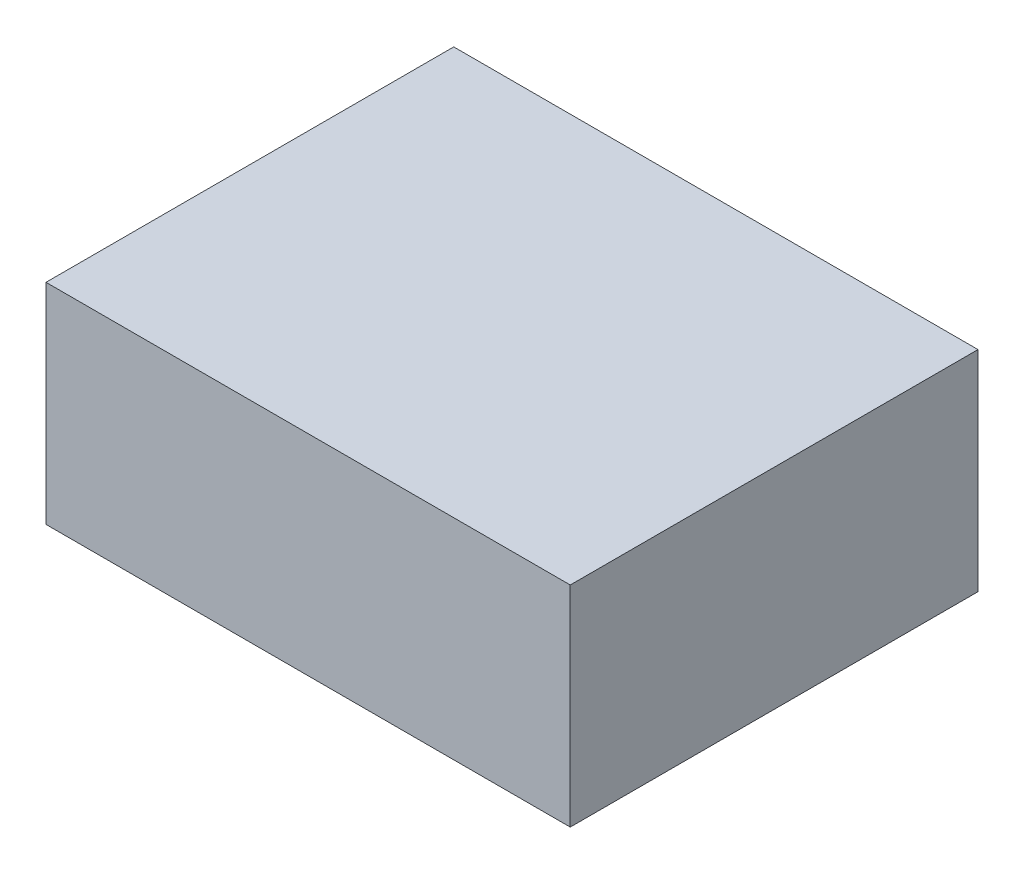
ISO-10303-21;
HEADER;
FILE_DESCRIPTION(('STEP AP214'),'2;1');
FILE_NAME('part.step','',(''),(''),'','','');
FILE_SCHEMA(('AUTOMOTIVE_DESIGN { 1 0 10303 214 1 1 1 1 }'));
ENDSEC;
DATA;
#1=APPLICATION_CONTEXT('core data for automotive mechanical design processes');
#2=APPLICATION_PROTOCOL_DEFINITION('international standard','automotive_design',2000,#1);
#3=PRODUCT_CONTEXT('',#1,'mechanical');
#4=PRODUCT('Part','Part','',(#3));
#5=PRODUCT_RELATED_PRODUCT_CATEGORY('part','',(#4));
#6=PRODUCT_DEFINITION_FORMATION('','',#4);
#7=PRODUCT_DEFINITION_CONTEXT('part definition',#1,'design');
#8=PRODUCT_DEFINITION('design','',#6,#7);
#9=PRODUCT_DEFINITION_SHAPE('','',#8);
#10=(LENGTH_UNIT() NAMED_UNIT(*) SI_UNIT(.MILLI.,.METRE.));
#11=(NAMED_UNIT(*) PLANE_ANGLE_UNIT() SI_UNIT($,.RADIAN.));
#12=(NAMED_UNIT(*) SI_UNIT($,.STERADIAN.) SOLID_ANGLE_UNIT());
#13=UNCERTAINTY_MEASURE_WITH_UNIT(LENGTH_MEASURE(1.E-05),#10,'distance_accuracy_value','');
#14=(GEOMETRIC_REPRESENTATION_CONTEXT(3) GLOBAL_UNCERTAINTY_ASSIGNED_CONTEXT((#13)) GLOBAL_UNIT_ASSIGNED_CONTEXT((#10,
#11,#12)) REPRESENTATION_CONTEXT('',''));
#15=CARTESIAN_POINT('',(0.,0.,0.));
#16=DIRECTION('',(0.,0.,1.));
#17=DIRECTION('',(1.,0.,0.));
#18=AXIS2_PLACEMENT_3D('',#15,#16,#17);
#19=CARTESIAN_POINT('',(22.5,18.,17.5));
#20=DIRECTION('',(-1.,0.,0.));
#21=DIRECTION('',(0.,0.,1.));
#22=AXIS2_PLACEMENT_3D('',#19,#20,#21);
#23=PLANE('',#22);
#24=DIRECTION('',(0.,0.,-1.));
#25=VECTOR('',#24,1.);
#26=CARTESIAN_POINT('',(22.5,0.,17.5));
#27=LINE('',#26,#25);
#28=CARTESIAN_POINT('',(22.5,0.,17.5));
#29=VERTEX_POINT('',#28);
#30=CARTESIAN_POINT('',(22.5,0.,-17.5));
#31=VERTEX_POINT('',#30);
#32=EDGE_CURVE('E105',#29,#31,#27,.T.);
#33=ORIENTED_EDGE('',*,*,#32,.T.);
#34=DIRECTION('',(0.,-1.,0.));
#35=VECTOR('',#34,1.);
#36=CARTESIAN_POINT('',(22.5,18.,-17.5));
#37=LINE('',#36,#35);
#38=CARTESIAN_POINT('',(22.5,18.,-17.5));
#39=VERTEX_POINT('',#38);
#40=EDGE_CURVE('E11',#39,#31,#37,.T.);
#41=ORIENTED_EDGE('',*,*,#40,.F.);
#42=DIRECTION('',(0.,0.,-1.));
#43=VECTOR('',#42,1.);
#44=CARTESIAN_POINT('',(22.5,18.,17.5));
#45=LINE('',#44,#43);
#46=CARTESIAN_POINT('',(22.5,18.,17.5));
#47=VERTEX_POINT('',#46);
#48=EDGE_CURVE('E88',#47,#39,#45,.T.);
#49=ORIENTED_EDGE('',*,*,#48,.F.);
#50=DIRECTION('',(0.,-1.,0.));
#51=VECTOR('',#50,1.);
#52=CARTESIAN_POINT('',(22.5,18.,17.5));
#53=LINE('',#52,#51);
#54=EDGE_CURVE('E101',#47,#29,#53,.T.);
#55=ORIENTED_EDGE('',*,*,#54,.T.);
#56=EDGE_LOOP('',(#33,#41,#49,#55));
#57=FACE_BOUND('',#56,.T.);
#58=ADVANCED_FACE('F36',(#57),#23,.F.);
#59=CARTESIAN_POINT('',(-22.5,18.,-17.5));
#60=DIRECTION('',(0.,0.,1.));
#61=DIRECTION('',(1.,0.,0.));
#62=AXIS2_PLACEMENT_3D('',#59,#60,#61);
#63=PLANE('',#62);
#64=DIRECTION('',(-1.,0.,0.));
#65=VECTOR('',#64,1.);
#66=CARTESIAN_POINT('',(-22.5,0.,-17.5));
#67=LINE('',#66,#65);
#68=CARTESIAN_POINT('',(-22.5,0.,-17.5));
#69=VERTEX_POINT('',#68);
#70=EDGE_CURVE('E93',#31,#69,#67,.T.);
#71=ORIENTED_EDGE('',*,*,#70,.T.);
#72=DIRECTION('',(0.,-1.,0.));
#73=VECTOR('',#72,1.);
#74=CARTESIAN_POINT('',(-22.5,18.,-17.5));
#75=LINE('',#74,#73);
#76=CARTESIAN_POINT('',(-22.5,18.,-17.5));
#77=VERTEX_POINT('',#76);
#78=EDGE_CURVE('E45',#77,#69,#75,.T.);
#79=ORIENTED_EDGE('',*,*,#78,.F.);
#80=DIRECTION('',(-1.,0.,0.));
#81=VECTOR('',#80,1.);
#82=CARTESIAN_POINT('',(-22.5,18.,-17.5));
#83=LINE('',#82,#81);
#84=EDGE_CURVE('E83',#39,#77,#83,.T.);
#85=ORIENTED_EDGE('',*,*,#84,.F.);
#86=ORIENTED_EDGE('',*,*,#40,.T.);
#87=EDGE_LOOP('',(#71,#79,#85,#86));
#88=FACE_BOUND('',#87,.T.);
#89=ADVANCED_FACE('F92',(#88),#63,.F.);
#90=CARTESIAN_POINT('',(-22.5,18.,17.5));
#91=DIRECTION('',(1.,0.,0.));
#92=DIRECTION('',(0.,0.,-1.));
#93=AXIS2_PLACEMENT_3D('',#90,#91,#92);
#94=PLANE('',#93);
#95=DIRECTION('',(0.,0.,1.));
#96=VECTOR('',#95,1.);
#97=CARTESIAN_POINT('',(-22.5,0.,17.5));
#98=LINE('',#97,#96);
#99=CARTESIAN_POINT('',(-22.5,0.,17.5));
#100=VERTEX_POINT('',#99);
#101=EDGE_CURVE('E70',#69,#100,#98,.T.);
#102=ORIENTED_EDGE('',*,*,#101,.T.);
#103=DIRECTION('',(0.,-1.,0.));
#104=VECTOR('',#103,1.);
#105=CARTESIAN_POINT('',(-22.5,18.,17.5));
#106=LINE('',#105,#104);
#107=CARTESIAN_POINT('',(-22.5,18.,17.5));
#108=VERTEX_POINT('',#107);
#109=EDGE_CURVE('E95',#108,#100,#106,.T.);
#110=ORIENTED_EDGE('',*,*,#109,.F.);
#111=DIRECTION('',(0.,0.,1.));
#112=VECTOR('',#111,1.);
#113=CARTESIAN_POINT('',(-22.5,18.,17.5));
#114=LINE('',#113,#112);
#115=EDGE_CURVE('E86',#77,#108,#114,.T.);
#116=ORIENTED_EDGE('',*,*,#115,.F.);
#117=ORIENTED_EDGE('',*,*,#78,.T.);
#118=EDGE_LOOP('',(#102,#110,#116,#117));
#119=FACE_BOUND('',#118,.T.);
#120=ADVANCED_FACE('F96',(#119),#94,.F.);
#121=CARTESIAN_POINT('',(-22.5,18.,17.5));
#122=DIRECTION('',(0.,0.,-1.));
#123=DIRECTION('',(-1.,0.,0.));
#124=AXIS2_PLACEMENT_3D('',#121,#122,#123);
#125=PLANE('',#124);
#126=DIRECTION('',(1.,0.,0.));
#127=VECTOR('',#126,1.);
#128=CARTESIAN_POINT('',(-22.5,0.,17.5));
#129=LINE('',#128,#127);
#130=EDGE_CURVE('E76',#100,#29,#129,.T.);
#131=ORIENTED_EDGE('',*,*,#130,.T.);
#132=ORIENTED_EDGE('',*,*,#54,.F.);
#133=DIRECTION('',(1.,0.,0.));
#134=VECTOR('',#133,1.);
#135=CARTESIAN_POINT('',(-22.5,18.,17.5));
#136=LINE('',#135,#134);
#137=EDGE_CURVE('E53',#108,#47,#136,.T.);
#138=ORIENTED_EDGE('',*,*,#137,.F.);
#139=ORIENTED_EDGE('',*,*,#109,.T.);
#140=EDGE_LOOP('',(#131,#132,#138,#139));
#141=FACE_BOUND('',#140,.T.);
#142=ADVANCED_FACE('F117',(#141),#125,.F.);
#143=CARTESIAN_POINT('',(0.,18.,0.));
#144=DIRECTION('',(0.,-1.,0.));
#145=DIRECTION('',(0.,0.,-1.));
#146=AXIS2_PLACEMENT_3D('',#143,#144,#145);
#147=PLANE('',#146);
#148=ORIENTED_EDGE('',*,*,#48,.T.);
#149=ORIENTED_EDGE('',*,*,#84,.T.);
#150=ORIENTED_EDGE('',*,*,#115,.T.);
#151=ORIENTED_EDGE('',*,*,#137,.T.);
#152=EDGE_LOOP('',(#148,#149,#150,#151));
#153=FACE_BOUND('',#152,.T.);
#154=ADVANCED_FACE('F84',(#153),#147,.F.);
#155=CARTESIAN_POINT('',(0.,0.,0.));
#156=DIRECTION('',(0.,-1.,0.));
#157=DIRECTION('',(0.,0.,-1.));
#158=AXIS2_PLACEMENT_3D('',#155,#156,#157);
#159=PLANE('',#158);
#160=ORIENTED_EDGE('',*,*,#32,.F.);
#161=ORIENTED_EDGE('',*,*,#130,.F.);
#162=ORIENTED_EDGE('',*,*,#101,.F.);
#163=ORIENTED_EDGE('',*,*,#70,.F.);
#164=EDGE_LOOP('',(#160,#161,#162,#163));
#165=FACE_BOUND('',#164,.T.);
#166=ADVANCED_FACE('F120',(#165),#159,.T.);
#167=CLOSED_SHELL('',(#58,#89,#120,#142,#154,#166));
#168=MANIFOLD_SOLID_BREP('B2',#167);
#169=ADVANCED_BREP_SHAPE_REPRESENTATION('',(#18,#168),#14);
#170=SHAPE_DEFINITION_REPRESENTATION(#9,#169);
ENDSEC;
END-ISO-10303-21;
